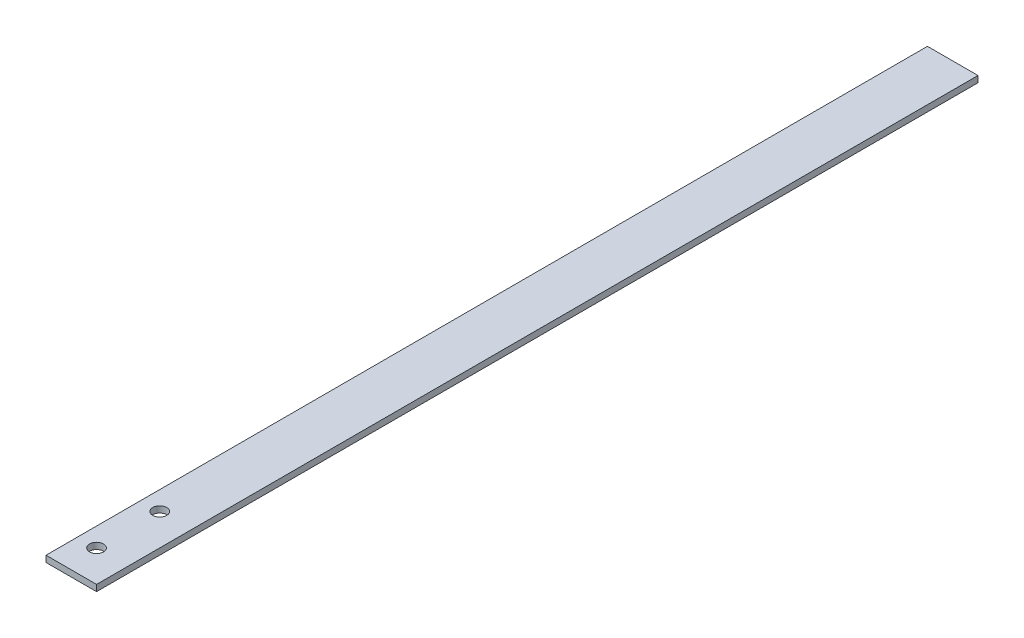
ISO-10303-21;
HEADER;
FILE_DESCRIPTION(('STEP AP214'),'2;1');
FILE_NAME('part.step','',(''),(''),'','','');
FILE_SCHEMA(('AUTOMOTIVE_DESIGN { 1 0 10303 214 1 1 1 1 }'));
ENDSEC;
DATA;
#1=APPLICATION_CONTEXT('core data for automotive mechanical design processes');
#2=APPLICATION_PROTOCOL_DEFINITION('international standard','automotive_design',2000,#1);
#3=PRODUCT_CONTEXT('',#1,'mechanical');
#4=PRODUCT('Part','Part','',(#3));
#5=PRODUCT_RELATED_PRODUCT_CATEGORY('part','',(#4));
#6=PRODUCT_DEFINITION_FORMATION('','',#4);
#7=PRODUCT_DEFINITION_CONTEXT('part definition',#1,'design');
#8=PRODUCT_DEFINITION('design','',#6,#7);
#9=PRODUCT_DEFINITION_SHAPE('','',#8);
#10=(LENGTH_UNIT() NAMED_UNIT(*) SI_UNIT(.MILLI.,.METRE.));
#11=(NAMED_UNIT(*) PLANE_ANGLE_UNIT() SI_UNIT($,.RADIAN.));
#12=(NAMED_UNIT(*) SI_UNIT($,.STERADIAN.) SOLID_ANGLE_UNIT());
#13=UNCERTAINTY_MEASURE_WITH_UNIT(LENGTH_MEASURE(1.E-05),#10,'distance_accuracy_value','');
#14=(GEOMETRIC_REPRESENTATION_CONTEXT(3) GLOBAL_UNCERTAINTY_ASSIGNED_CONTEXT((#13)) GLOBAL_UNIT_ASSIGNED_CONTEXT((#10,
#11,#12)) REPRESENTATION_CONTEXT('',''));
#15=CARTESIAN_POINT('',(0.,0.,0.));
#16=DIRECTION('',(0.,0.,1.));
#17=DIRECTION('',(1.,0.,0.));
#18=AXIS2_PLACEMENT_3D('',#15,#16,#17);
#19=CARTESIAN_POINT('',(-28.2015195369031,7.29457308248912,-130.499999999999));
#20=DIRECTION('',(0.,-1.,0.));
#21=DIRECTION('',(0.,0.,-1.));
#22=AXIS2_PLACEMENT_3D('',#19,#20,#21);
#23=PLANE('',#22);
#24=CARTESIAN_POINT('',(-25.2015195369031,7.29457308248912,4.00000000000054));
#25=DIRECTION('',(0.,1.,0.));
#26=DIRECTION('',(0.,0.,1.));
#27=AXIS2_PLACEMENT_3D('',#24,#25,#26);
#28=CIRCLE('',#27,1.10000000000001);
#29=CARTESIAN_POINT('',(-25.2015195369031,7.29457308248912,5.10000000000055));
#30=VERTEX_POINT('',#29);
#31=EDGE_CURVE('E82',#30,#30,#28,.F.);
#32=ORIENTED_EDGE('',*,*,#31,.T.);
#33=EDGE_LOOP('',(#32));
#34=FACE_BOUND('',#33,.T.);
#35=CARTESIAN_POINT('',(-25.2015195369031,7.29457308248913,-5.99999999999946));
#36=DIRECTION('',(0.,-1.,0.));
#37=DIRECTION('',(0.,0.,-1.));
#38=AXIS2_PLACEMENT_3D('',#35,#36,#37);
#39=CIRCLE('',#38,1.10000000000001);
#40=CARTESIAN_POINT('',(-25.2015195369031,7.29457308248913,-7.09999999999947));
#41=VERTEX_POINT('',#40);
#42=EDGE_CURVE('E20',#41,#41,#39,.T.);
#43=ORIENTED_EDGE('',*,*,#42,.T.);
#44=EDGE_LOOP('',(#43));
#45=FACE_BOUND('',#44,.T.);
#46=DIRECTION('',(1.,0.,0.));
#47=VECTOR('',#46,1.);
#48=CARTESIAN_POINT('',(-28.2015195369031,7.29457308248912,-130.499999999999));
#49=LINE('',#48,#47);
#50=CARTESIAN_POINT('',(-20.201519536903,7.29457308248912,-130.499999999999));
#51=VERTEX_POINT('',#50);
#52=CARTESIAN_POINT('',(-28.2015195369031,7.29457308248912,-130.499999999999));
#53=VERTEX_POINT('',#52);
#54=EDGE_CURVE('E59',#51,#53,#49,.F.);
#55=ORIENTED_EDGE('',*,*,#54,.T.);
#56=DIRECTION('',(0.,0.,1.));
#57=VECTOR('',#56,1.);
#58=CARTESIAN_POINT('',(-28.2015195369031,7.29457308248912,-130.499999999999));
#59=LINE('',#58,#57);
#60=CARTESIAN_POINT('',(-28.2015195369031,7.29457308248912,9.00000000000054));
#61=VERTEX_POINT('',#60);
#62=EDGE_CURVE('E56',#61,#53,#59,.F.);
#63=ORIENTED_EDGE('',*,*,#62,.F.);
#64=DIRECTION('',(-1.,0.,0.));
#65=VECTOR('',#64,1.);
#66=CARTESIAN_POINT('',(-28.2015195369031,7.29457308248912,9.00000000000054));
#67=LINE('',#66,#65);
#68=CARTESIAN_POINT('',(-20.201519536903,7.29457308248912,9.00000000000054));
#69=VERTEX_POINT('',#68);
#70=EDGE_CURVE('E97',#61,#69,#67,.F.);
#71=ORIENTED_EDGE('',*,*,#70,.T.);
#72=DIRECTION('',(0.,0.,1.));
#73=VECTOR('',#72,1.);
#74=CARTESIAN_POINT('',(-20.201519536903,7.29457308248912,-130.499999999999));
#75=LINE('',#74,#73);
#76=EDGE_CURVE('E60',#69,#51,#75,.F.);
#77=ORIENTED_EDGE('',*,*,#76,.T.);
#78=EDGE_LOOP('',(#55,#63,#71,#77));
#79=FACE_BOUND('',#78,.T.);
#80=ADVANCED_FACE('F17',(#34,#45,#79),#23,.F.);
#81=CARTESIAN_POINT('',(-28.2015195369031,7.29457308248912,-130.499999999999));
#82=DIRECTION('',(0.,0.,1.));
#83=DIRECTION('',(1.,0.,0.));
#84=AXIS2_PLACEMENT_3D('',#81,#82,#83);
#85=PLANE('',#84);
#86=DIRECTION('',(1.,0.,0.));
#87=VECTOR('',#86,1.);
#88=CARTESIAN_POINT('',(-28.2015195369031,6.29457308248912,-130.499999999999));
#89=LINE('',#88,#87);
#90=CARTESIAN_POINT('',(-20.201519536903,6.29457308248912,-130.499999999999));
#91=VERTEX_POINT('',#90);
#92=CARTESIAN_POINT('',(-28.2015195369031,6.29457308248912,-130.499999999999));
#93=VERTEX_POINT('',#92);
#94=EDGE_CURVE('E76',#91,#93,#89,.F.);
#95=ORIENTED_EDGE('',*,*,#94,.T.);
#96=DIRECTION('',(0.,1.,0.));
#97=VECTOR('',#96,1.);
#98=CARTESIAN_POINT('',(-28.2015195369031,6.29457308248912,-130.499999999999));
#99=LINE('',#98,#97);
#100=EDGE_CURVE('E65',#53,#93,#99,.F.);
#101=ORIENTED_EDGE('',*,*,#100,.F.);
#102=ORIENTED_EDGE('',*,*,#54,.F.);
#103=DIRECTION('',(0.,1.,0.));
#104=VECTOR('',#103,1.);
#105=CARTESIAN_POINT('',(-20.201519536903,6.29457308248912,-130.499999999999));
#106=LINE('',#105,#104);
#107=EDGE_CURVE('E89',#51,#91,#106,.F.);
#108=ORIENTED_EDGE('',*,*,#107,.T.);
#109=EDGE_LOOP('',(#95,#101,#102,#108));
#110=FACE_BOUND('',#109,.T.);
#111=ADVANCED_FACE('F75',(#110),#85,.F.);
#112=CARTESIAN_POINT('',(-28.2015195369031,6.29457308248912,-130.499999999999));
#113=DIRECTION('',(-1.,0.,0.));
#114=DIRECTION('',(0.,0.,1.));
#115=AXIS2_PLACEMENT_3D('',#112,#113,#114);
#116=PLANE('',#115);
#117=DIRECTION('',(0.,1.,0.));
#118=VECTOR('',#117,1.);
#119=CARTESIAN_POINT('',(-28.2015195369031,7.29457308248912,9.00000000000054));
#120=LINE('',#119,#118);
#121=CARTESIAN_POINT('',(-28.2015195369031,6.29457308248912,9.00000000000054));
#122=VERTEX_POINT('',#121);
#123=EDGE_CURVE('E72',#122,#61,#120,.T.);
#124=ORIENTED_EDGE('',*,*,#123,.T.);
#125=ORIENTED_EDGE('',*,*,#62,.T.);
#126=ORIENTED_EDGE('',*,*,#100,.T.);
#127=DIRECTION('',(0.,0.,1.));
#128=VECTOR('',#127,1.);
#129=CARTESIAN_POINT('',(-28.2015195369031,6.29457308248912,-130.499999999999));
#130=LINE('',#129,#128);
#131=EDGE_CURVE('E86',#93,#122,#130,.T.);
#132=ORIENTED_EDGE('',*,*,#131,.T.);
#133=EDGE_LOOP('',(#124,#125,#126,#132));
#134=FACE_BOUND('',#133,.T.);
#135=ADVANCED_FACE('F69',(#134),#116,.T.);
#136=CARTESIAN_POINT('',(-28.2015195369031,7.29457308248912,9.00000000000054));
#137=DIRECTION('',(0.,0.,-1.));
#138=DIRECTION('',(-1.,0.,0.));
#139=AXIS2_PLACEMENT_3D('',#136,#137,#138);
#140=PLANE('',#139);
#141=ORIENTED_EDGE('',*,*,#70,.F.);
#142=ORIENTED_EDGE('',*,*,#123,.F.);
#143=DIRECTION('',(1.,0.,0.));
#144=VECTOR('',#143,1.);
#145=CARTESIAN_POINT('',(-28.2015195369031,6.29457308248912,9.00000000000053));
#146=LINE('',#145,#144);
#147=CARTESIAN_POINT('',(-20.201519536903,6.29457308248912,9.00000000000054));
#148=VERTEX_POINT('',#147);
#149=EDGE_CURVE('E103',#122,#148,#146,.T.);
#150=ORIENTED_EDGE('',*,*,#149,.T.);
#151=DIRECTION('',(0.,1.,0.));
#152=VECTOR('',#151,1.);
#153=CARTESIAN_POINT('',(-20.201519536903,6.29457308248912,9.00000000000053));
#154=LINE('',#153,#152);
#155=EDGE_CURVE('E35',#148,#69,#154,.T.);
#156=ORIENTED_EDGE('',*,*,#155,.T.);
#157=EDGE_LOOP('',(#141,#142,#150,#156));
#158=FACE_BOUND('',#157,.T.);
#159=ADVANCED_FACE('F101',(#158),#140,.F.);
#160=CARTESIAN_POINT('',(-20.201519536903,6.29457308248912,-130.499999999999));
#161=DIRECTION('',(-1.,0.,0.));
#162=DIRECTION('',(0.,0.,1.));
#163=AXIS2_PLACEMENT_3D('',#160,#161,#162);
#164=PLANE('',#163);
#165=ORIENTED_EDGE('',*,*,#76,.F.);
#166=ORIENTED_EDGE('',*,*,#155,.F.);
#167=DIRECTION('',(0.,0.,1.));
#168=VECTOR('',#167,1.);
#169=CARTESIAN_POINT('',(-20.201519536903,6.29457308248912,-130.499999999999));
#170=LINE('',#169,#168);
#171=EDGE_CURVE('E81',#148,#91,#170,.F.);
#172=ORIENTED_EDGE('',*,*,#171,.T.);
#173=ORIENTED_EDGE('',*,*,#107,.F.);
#174=EDGE_LOOP('',(#165,#166,#172,#173));
#175=FACE_BOUND('',#174,.T.);
#176=ADVANCED_FACE('F99',(#175),#164,.F.);
#177=CARTESIAN_POINT('',(-25.2015195369031,-126.706426917511,-5.99999999999946));
#178=DIRECTION('',(0.,-1.,0.));
#179=DIRECTION('',(0.,0.,-1.));
#180=AXIS2_PLACEMENT_3D('',#177,#178,#179);
#181=CYLINDRICAL_SURFACE('',#180,1.10000000000001);
#182=ORIENTED_EDGE('',*,*,#42,.F.);
#183=EDGE_LOOP('',(#182));
#184=FACE_BOUND('',#183,.T.);
#185=CARTESIAN_POINT('',(-25.2015195369031,6.29457308248912,-5.99999999999946));
#186=DIRECTION('',(0.,-1.,0.));
#187=DIRECTION('',(0.,0.,-1.));
#188=AXIS2_PLACEMENT_3D('',#185,#186,#187);
#189=CIRCLE('',#188,1.10000000000001);
#190=CARTESIAN_POINT('',(-25.2015195369031,6.29457308248912,-7.09999999999947));
#191=VERTEX_POINT('',#190);
#192=EDGE_CURVE('E26',#191,#191,#189,.T.);
#193=ORIENTED_EDGE('',*,*,#192,.T.);
#194=EDGE_LOOP('',(#193));
#195=FACE_BOUND('',#194,.T.);
#196=ADVANCED_FACE('F116',(#184,#195),#181,.F.);
#197=CARTESIAN_POINT('',(-25.2015195369031,7.29457308248912,4.00000000000054));
#198=DIRECTION('',(0.,1.,0.));
#199=DIRECTION('',(0.,0.,1.));
#200=AXIS2_PLACEMENT_3D('',#197,#198,#199);
#201=CYLINDRICAL_SURFACE('',#200,1.10000000000001);
#202=CARTESIAN_POINT('',(-25.2015195369031,6.29457308248912,4.00000000000054));
#203=DIRECTION('',(0.,1.,0.));
#204=DIRECTION('',(0.,0.,1.));
#205=AXIS2_PLACEMENT_3D('',#202,#203,#204);
#206=CIRCLE('',#205,1.10000000000001);
#207=CARTESIAN_POINT('',(-25.2015195369031,6.29457308248912,5.10000000000055));
#208=VERTEX_POINT('',#207);
#209=EDGE_CURVE('E11',#208,#208,#206,.F.);
#210=ORIENTED_EDGE('',*,*,#209,.T.);
#211=EDGE_LOOP('',(#210));
#212=FACE_BOUND('',#211,.T.);
#213=ORIENTED_EDGE('',*,*,#31,.F.);
#214=EDGE_LOOP('',(#213));
#215=FACE_BOUND('',#214,.T.);
#216=ADVANCED_FACE('F109',(#212,#215),#201,.F.);
#217=CARTESIAN_POINT('',(-28.2015195369031,6.29457308248912,-130.499999999999));
#218=DIRECTION('',(0.,1.,0.));
#219=DIRECTION('',(0.,0.,1.));
#220=AXIS2_PLACEMENT_3D('',#217,#218,#219);
#221=PLANE('',#220);
#222=ORIENTED_EDGE('',*,*,#209,.F.);
#223=EDGE_LOOP('',(#222));
#224=FACE_BOUND('',#223,.T.);
#225=ORIENTED_EDGE('',*,*,#192,.F.);
#226=EDGE_LOOP('',(#225));
#227=FACE_BOUND('',#226,.T.);
#228=ORIENTED_EDGE('',*,*,#149,.F.);
#229=ORIENTED_EDGE('',*,*,#131,.F.);
#230=ORIENTED_EDGE('',*,*,#94,.F.);
#231=ORIENTED_EDGE('',*,*,#171,.F.);
#232=EDGE_LOOP('',(#228,#229,#230,#231));
#233=FACE_BOUND('',#232,.T.);
#234=ADVANCED_FACE('F107',(#224,#227,#233),#221,.F.);
#235=CLOSED_SHELL('',(#80,#111,#135,#159,#176,#196,#216,#234));
#236=MANIFOLD_SOLID_BREP('B1',#235);
#237=ADVANCED_BREP_SHAPE_REPRESENTATION('',(#18,#236),#14);
#238=SHAPE_DEFINITION_REPRESENTATION(#9,#237);
ENDSEC;
END-ISO-10303-21;
